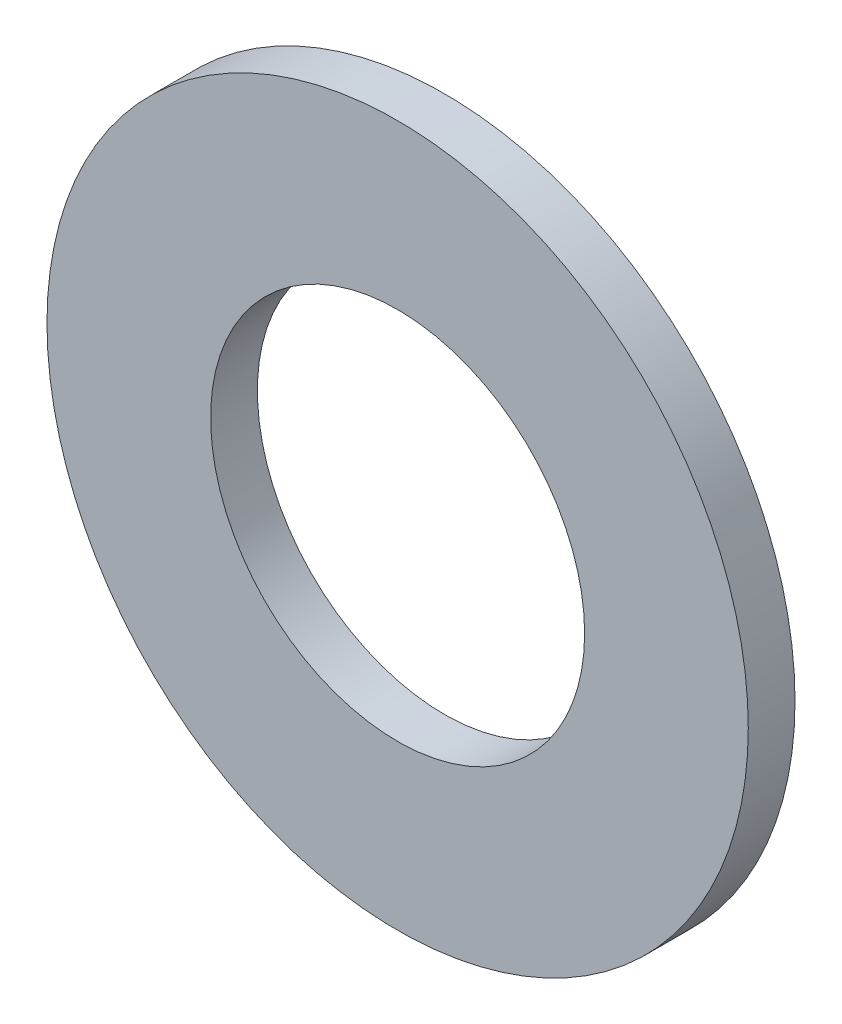
ISO-10303-21;
HEADER;
FILE_DESCRIPTION(('STEP AP214'),'2;1');
FILE_NAME('part.step','',(''),(''),'','','');
FILE_SCHEMA(('AUTOMOTIVE_DESIGN { 1 0 10303 214 1 1 1 1 }'));
ENDSEC;
DATA;
#1=APPLICATION_CONTEXT('core data for automotive mechanical design processes');
#2=APPLICATION_PROTOCOL_DEFINITION('international standard','automotive_design',2000,#1);
#3=PRODUCT_CONTEXT('',#1,'mechanical');
#4=PRODUCT('Part','Part','',(#3));
#5=PRODUCT_RELATED_PRODUCT_CATEGORY('part','',(#4));
#6=PRODUCT_DEFINITION_FORMATION('','',#4);
#7=PRODUCT_DEFINITION_CONTEXT('part definition',#1,'design');
#8=PRODUCT_DEFINITION('design','',#6,#7);
#9=PRODUCT_DEFINITION_SHAPE('','',#8);
#10=(LENGTH_UNIT() NAMED_UNIT(*) SI_UNIT(.MILLI.,.METRE.));
#11=(NAMED_UNIT(*) PLANE_ANGLE_UNIT() SI_UNIT($,.RADIAN.));
#12=(NAMED_UNIT(*) SI_UNIT($,.STERADIAN.) SOLID_ANGLE_UNIT());
#13=UNCERTAINTY_MEASURE_WITH_UNIT(LENGTH_MEASURE(1.E-05),#10,'distance_accuracy_value','');
#14=(GEOMETRIC_REPRESENTATION_CONTEXT(3) GLOBAL_UNCERTAINTY_ASSIGNED_CONTEXT((#13)) GLOBAL_UNIT_ASSIGNED_CONTEXT((#10,
#11,#12)) REPRESENTATION_CONTEXT('',''));
#15=CARTESIAN_POINT('',(0.,0.,0.));
#16=DIRECTION('',(0.,0.,1.));
#17=DIRECTION('',(1.,0.,0.));
#18=AXIS2_PLACEMENT_3D('',#15,#16,#17);
#19=CARTESIAN_POINT('',(0.,0.,0.4));
#20=DIRECTION('',(0.,0.,1.));
#21=DIRECTION('',(1.,0.,0.));
#22=AXIS2_PLACEMENT_3D('',#19,#20,#21);
#23=PLANE('',#22);
#24=CARTESIAN_POINT('',(0.,0.,0.4));
#25=DIRECTION('',(0.,0.,1.));
#26=DIRECTION('',(1.,0.,0.));
#27=AXIS2_PLACEMENT_3D('',#24,#25,#26);
#28=CIRCLE('',#27,3.);
#29=CARTESIAN_POINT('',(3.,0.,0.4));
#30=VERTEX_POINT('',#29);
#31=EDGE_CURVE('E10',#30,#30,#28,.T.);
#32=ORIENTED_EDGE('',*,*,#31,.T.);
#33=EDGE_LOOP('',(#32));
#34=FACE_BOUND('',#33,.T.);
#35=CARTESIAN_POINT('',(0.,0.,0.4));
#36=DIRECTION('',(0.,0.,1.));
#37=DIRECTION('',(1.,0.,0.));
#38=AXIS2_PLACEMENT_3D('',#35,#36,#37);
#39=CIRCLE('',#38,1.6);
#40=CARTESIAN_POINT('',(1.6,0.,0.4));
#41=VERTEX_POINT('',#40);
#42=EDGE_CURVE('E40',#41,#41,#39,.T.);
#43=ORIENTED_EDGE('',*,*,#42,.F.);
#44=EDGE_LOOP('',(#43));
#45=FACE_BOUND('',#44,.T.);
#46=ADVANCED_FACE('F29',(#34,#45),#23,.T.);
#47=CARTESIAN_POINT('',(0.,0.,0.));
#48=DIRECTION('',(0.,0.,1.));
#49=DIRECTION('',(1.,0.,0.));
#50=AXIS2_PLACEMENT_3D('',#47,#48,#49);
#51=PLANE('',#50);
#52=CARTESIAN_POINT('',(0.,0.,0.));
#53=DIRECTION('',(0.,0.,1.));
#54=DIRECTION('',(1.,0.,0.));
#55=AXIS2_PLACEMENT_3D('',#52,#53,#54);
#56=CIRCLE('',#55,3.);
#57=CARTESIAN_POINT('',(3.,0.,0.));
#58=VERTEX_POINT('',#57);
#59=EDGE_CURVE('E33',#58,#58,#56,.T.);
#60=ORIENTED_EDGE('',*,*,#59,.F.);
#61=EDGE_LOOP('',(#60));
#62=FACE_BOUND('',#61,.T.);
#63=CARTESIAN_POINT('',(0.,0.,0.));
#64=DIRECTION('',(0.,0.,1.));
#65=DIRECTION('',(1.,0.,0.));
#66=AXIS2_PLACEMENT_3D('',#63,#64,#65);
#67=CIRCLE('',#66,1.6);
#68=CARTESIAN_POINT('',(1.6,0.,0.));
#69=VERTEX_POINT('',#68);
#70=EDGE_CURVE('E42',#69,#69,#67,.T.);
#71=ORIENTED_EDGE('',*,*,#70,.T.);
#72=EDGE_LOOP('',(#71));
#73=FACE_BOUND('',#72,.T.);
#74=ADVANCED_FACE('F52',(#62,#73),#51,.F.);
#75=CARTESIAN_POINT('',(0.,0.,0.4));
#76=DIRECTION('',(0.,0.,-1.));
#77=DIRECTION('',(-1.,0.,0.));
#78=AXIS2_PLACEMENT_3D('',#75,#76,#77);
#79=CYLINDRICAL_SURFACE('',#78,3.);
#80=ORIENTED_EDGE('',*,*,#31,.F.);
#81=EDGE_LOOP('',(#80));
#82=FACE_BOUND('',#81,.T.);
#83=ORIENTED_EDGE('',*,*,#59,.T.);
#84=EDGE_LOOP('',(#83));
#85=FACE_BOUND('',#84,.T.);
#86=ADVANCED_FACE('F31',(#82,#85),#79,.T.);
#87=CARTESIAN_POINT('',(0.,0.,0.4));
#88=DIRECTION('',(0.,0.,-1.));
#89=DIRECTION('',(-1.,0.,0.));
#90=AXIS2_PLACEMENT_3D('',#87,#88,#89);
#91=CYLINDRICAL_SURFACE('',#90,1.6);
#92=ORIENTED_EDGE('',*,*,#42,.T.);
#93=EDGE_LOOP('',(#92));
#94=FACE_BOUND('',#93,.T.);
#95=ORIENTED_EDGE('',*,*,#70,.F.);
#96=EDGE_LOOP('',(#95));
#97=FACE_BOUND('',#96,.T.);
#98=ADVANCED_FACE('F48',(#94,#97),#91,.F.);
#99=CLOSED_SHELL('',(#46,#74,#86,#98));
#100=MANIFOLD_SOLID_BREP('B2',#99);
#101=ADVANCED_BREP_SHAPE_REPRESENTATION('',(#18,#100),#14);
#102=SHAPE_DEFINITION_REPRESENTATION(#9,#101);
ENDSEC;
END-ISO-10303-21;
